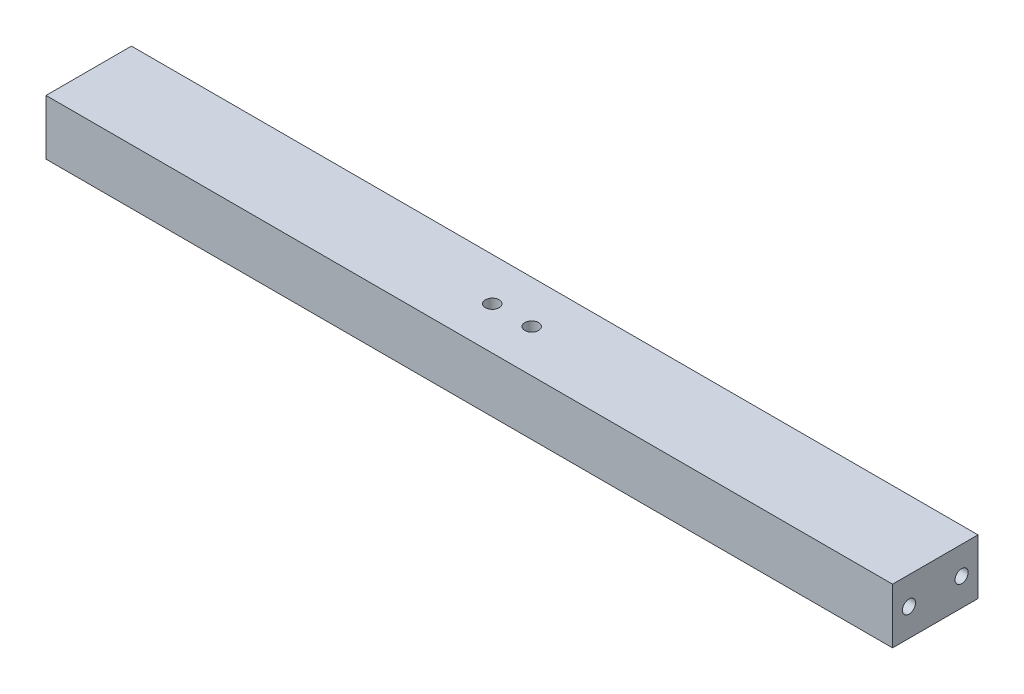
ISO-10303-21;
HEADER;
FILE_DESCRIPTION(('STEP AP214'),'2;1');
FILE_NAME('part.step','',(''),(''),'','','');
FILE_SCHEMA(('AUTOMOTIVE_DESIGN { 1 0 10303 214 1 1 1 1 }'));
ENDSEC;
DATA;
#1=APPLICATION_CONTEXT('core data for automotive mechanical design processes');
#2=APPLICATION_PROTOCOL_DEFINITION('international standard','automotive_design',2000,#1);
#3=PRODUCT_CONTEXT('',#1,'mechanical');
#4=PRODUCT('Part','Part','',(#3));
#5=PRODUCT_RELATED_PRODUCT_CATEGORY('part','',(#4));
#6=PRODUCT_DEFINITION_FORMATION('','',#4);
#7=PRODUCT_DEFINITION_CONTEXT('part definition',#1,'design');
#8=PRODUCT_DEFINITION('design','',#6,#7);
#9=PRODUCT_DEFINITION_SHAPE('','',#8);
#10=(LENGTH_UNIT() NAMED_UNIT(*) SI_UNIT(.MILLI.,.METRE.));
#11=(NAMED_UNIT(*) PLANE_ANGLE_UNIT() SI_UNIT($,.RADIAN.));
#12=(NAMED_UNIT(*) SI_UNIT($,.STERADIAN.) SOLID_ANGLE_UNIT());
#13=UNCERTAINTY_MEASURE_WITH_UNIT(LENGTH_MEASURE(1.E-05),#10,'distance_accuracy_value','');
#14=(GEOMETRIC_REPRESENTATION_CONTEXT(3) GLOBAL_UNCERTAINTY_ASSIGNED_CONTEXT((#13)) GLOBAL_UNIT_ASSIGNED_CONTEXT((#10,
#11,#12)) REPRESENTATION_CONTEXT('',''));
#15=CARTESIAN_POINT('',(0.,0.,0.));
#16=DIRECTION('',(0.,0.,1.));
#17=DIRECTION('',(1.,0.,0.));
#18=AXIS2_PLACEMENT_3D('',#15,#16,#17);
#19=CARTESIAN_POINT('',(-322.,21.,-65.));
#20=DIRECTION('',(-1.,0.,0.));
#21=DIRECTION('',(0.,0.,1.));
#22=AXIS2_PLACEMENT_3D('',#19,#20,#21);
#23=PLANE('',#22);
#24=CARTESIAN_POINT('',(-322.,0.,-12.5));
#25=DIRECTION('',(-1.,0.,0.));
#26=DIRECTION('',(0.,0.,1.));
#27=AXIS2_PLACEMENT_3D('',#24,#25,#26);
#28=CIRCLE('',#27,5.);
#29=CARTESIAN_POINT('',(-322.,0.,-7.5));
#30=VERTEX_POINT('',#29);
#31=EDGE_CURVE('E201',#30,#30,#28,.F.);
#32=ORIENTED_EDGE('',*,*,#31,.T.);
#33=EDGE_LOOP('',(#32));
#34=FACE_BOUND('',#33,.T.);
#35=CARTESIAN_POINT('',(-322.,0.,-52.5));
#36=DIRECTION('',(-1.,0.,0.));
#37=DIRECTION('',(0.,0.,1.));
#38=AXIS2_PLACEMENT_3D('',#35,#36,#37);
#39=CIRCLE('',#38,5.);
#40=CARTESIAN_POINT('',(-322.,0.,-47.5));
#41=VERTEX_POINT('',#40);
#42=EDGE_CURVE('E215',#41,#41,#39,.F.);
#43=ORIENTED_EDGE('',*,*,#42,.T.);
#44=EDGE_LOOP('',(#43));
#45=FACE_BOUND('',#44,.T.);
#46=DIRECTION('',(0.,-1.,0.));
#47=VECTOR('',#46,1.);
#48=CARTESIAN_POINT('',(-322.,21.,0.));
#49=LINE('',#48,#47);
#50=CARTESIAN_POINT('',(-322.,21.,0.));
#51=VERTEX_POINT('',#50);
#52=CARTESIAN_POINT('',(-322.,-21.,0.));
#53=VERTEX_POINT('',#52);
#54=EDGE_CURVE('E162',#51,#53,#49,.T.);
#55=ORIENTED_EDGE('',*,*,#54,.F.);
#56=DIRECTION('',(0.,0.,1.));
#57=VECTOR('',#56,1.);
#58=CARTESIAN_POINT('',(-322.,21.,-65.));
#59=LINE('',#58,#57);
#60=CARTESIAN_POINT('',(-322.,21.,-65.));
#61=VERTEX_POINT('',#60);
#62=EDGE_CURVE('E12',#61,#51,#59,.T.);
#63=ORIENTED_EDGE('',*,*,#62,.F.);
#64=DIRECTION('',(0.,-1.,0.));
#65=VECTOR('',#64,1.);
#66=CARTESIAN_POINT('',(-322.,21.,-65.));
#67=LINE('',#66,#65);
#68=CARTESIAN_POINT('',(-322.,-21.,-65.));
#69=VERTEX_POINT('',#68);
#70=EDGE_CURVE('E163',#61,#69,#67,.T.);
#71=ORIENTED_EDGE('',*,*,#70,.T.);
#72=DIRECTION('',(0.,0.,1.));
#73=VECTOR('',#72,1.);
#74=CARTESIAN_POINT('',(-322.,-21.,-65.));
#75=LINE('',#74,#73);
#76=EDGE_CURVE('E91',#69,#53,#75,.T.);
#77=ORIENTED_EDGE('',*,*,#76,.T.);
#78=EDGE_LOOP('',(#55,#63,#71,#77));
#79=FACE_BOUND('',#78,.T.);
#80=ADVANCED_FACE('F41',(#34,#45,#79),#23,.T.);
#81=CARTESIAN_POINT('',(-322.,21.,-65.));
#82=DIRECTION('',(0.,1.,0.));
#83=DIRECTION('',(-1.,0.,0.));
#84=AXIS2_PLACEMENT_3D('',#81,#82,#83);
#85=PLANE('',#84);
#86=CARTESIAN_POINT('',(-15.,21.,-32.5));
#87=DIRECTION('',(0.,-1.,0.));
#88=DIRECTION('',(1.,0.,0.));
#89=AXIS2_PLACEMENT_3D('',#86,#87,#88);
#90=CIRCLE('',#89,5.25);
#91=CARTESIAN_POINT('',(-9.74999999999999,21.,-32.5));
#92=VERTEX_POINT('',#91);
#93=EDGE_CURVE('E230',#92,#92,#90,.T.);
#94=ORIENTED_EDGE('',*,*,#93,.T.);
#95=EDGE_LOOP('',(#94));
#96=FACE_BOUND('',#95,.T.);
#97=CARTESIAN_POINT('',(15.,21.,-32.5));
#98=DIRECTION('',(0.,-1.,0.));
#99=DIRECTION('',(1.,0.,0.));
#100=AXIS2_PLACEMENT_3D('',#97,#98,#99);
#101=CIRCLE('',#100,5.25);
#102=CARTESIAN_POINT('',(20.25,21.,-32.5));
#103=VERTEX_POINT('',#102);
#104=EDGE_CURVE('E229',#103,#103,#101,.T.);
#105=ORIENTED_EDGE('',*,*,#104,.T.);
#106=EDGE_LOOP('',(#105));
#107=FACE_BOUND('',#106,.T.);
#108=DIRECTION('',(-1.,0.,0.));
#109=VECTOR('',#108,1.);
#110=CARTESIAN_POINT('',(-322.,21.,0.));
#111=LINE('',#110,#109);
#112=CARTESIAN_POINT('',(322.,21.,0.));
#113=VERTEX_POINT('',#112);
#114=EDGE_CURVE('E167',#113,#51,#111,.T.);
#115=ORIENTED_EDGE('',*,*,#114,.F.);
#116=DIRECTION('',(0.,0.,1.));
#117=VECTOR('',#116,1.);
#118=CARTESIAN_POINT('',(322.,21.,-65.));
#119=LINE('',#118,#117);
#120=CARTESIAN_POINT('',(322.,21.,-65.));
#121=VERTEX_POINT('',#120);
#122=EDGE_CURVE('E50',#121,#113,#119,.T.);
#123=ORIENTED_EDGE('',*,*,#122,.F.);
#124=DIRECTION('',(-1.,0.,0.));
#125=VECTOR('',#124,1.);
#126=CARTESIAN_POINT('',(-322.,21.,-65.));
#127=LINE('',#126,#125);
#128=EDGE_CURVE('E174',#121,#61,#127,.T.);
#129=ORIENTED_EDGE('',*,*,#128,.T.);
#130=ORIENTED_EDGE('',*,*,#62,.T.);
#131=EDGE_LOOP('',(#115,#123,#129,#130));
#132=FACE_BOUND('',#131,.T.);
#133=ADVANCED_FACE('F263',(#96,#107,#132),#85,.T.);
#134=CARTESIAN_POINT('',(322.,21.,-65.));
#135=DIRECTION('',(1.,0.,0.));
#136=DIRECTION('',(0.,0.,-1.));
#137=AXIS2_PLACEMENT_3D('',#134,#135,#136);
#138=PLANE('',#137);
#139=CARTESIAN_POINT('',(322.,0.,-12.5));
#140=DIRECTION('',(1.,0.,0.));
#141=DIRECTION('',(0.,0.,-1.));
#142=AXIS2_PLACEMENT_3D('',#139,#140,#141);
#143=CIRCLE('',#142,5.);
#144=CARTESIAN_POINT('',(322.,0.,-17.5));
#145=VERTEX_POINT('',#144);
#146=EDGE_CURVE('E209',#145,#145,#143,.T.);
#147=ORIENTED_EDGE('',*,*,#146,.F.);
#148=EDGE_LOOP('',(#147));
#149=FACE_BOUND('',#148,.T.);
#150=CARTESIAN_POINT('',(322.,0.,-52.5));
#151=DIRECTION('',(1.,0.,0.));
#152=DIRECTION('',(0.,0.,-1.));
#153=AXIS2_PLACEMENT_3D('',#150,#151,#152);
#154=CIRCLE('',#153,5.);
#155=CARTESIAN_POINT('',(322.,0.,-57.5));
#156=VERTEX_POINT('',#155);
#157=EDGE_CURVE('E218',#156,#156,#154,.T.);
#158=ORIENTED_EDGE('',*,*,#157,.F.);
#159=EDGE_LOOP('',(#158));
#160=FACE_BOUND('',#159,.T.);
#161=DIRECTION('',(0.,1.,0.));
#162=VECTOR('',#161,1.);
#163=CARTESIAN_POINT('',(322.,21.,0.));
#164=LINE('',#163,#162);
#165=CARTESIAN_POINT('',(322.,-21.,0.));
#166=VERTEX_POINT('',#165);
#167=EDGE_CURVE('E184',#166,#113,#164,.T.);
#168=ORIENTED_EDGE('',*,*,#167,.F.);
#169=DIRECTION('',(0.,0.,1.));
#170=VECTOR('',#169,1.);
#171=CARTESIAN_POINT('',(322.,-21.,-65.));
#172=LINE('',#171,#170);
#173=CARTESIAN_POINT('',(322.,-21.,-65.));
#174=VERTEX_POINT('',#173);
#175=EDGE_CURVE('E193',#174,#166,#172,.T.);
#176=ORIENTED_EDGE('',*,*,#175,.F.);
#177=DIRECTION('',(0.,1.,0.));
#178=VECTOR('',#177,1.);
#179=CARTESIAN_POINT('',(322.,21.,-65.));
#180=LINE('',#179,#178);
#181=EDGE_CURVE('E170',#174,#121,#180,.T.);
#182=ORIENTED_EDGE('',*,*,#181,.T.);
#183=ORIENTED_EDGE('',*,*,#122,.T.);
#184=EDGE_LOOP('',(#168,#176,#182,#183));
#185=FACE_BOUND('',#184,.T.);
#186=ADVANCED_FACE('F256',(#149,#160,#185),#138,.T.);
#187=CARTESIAN_POINT('',(-322.,-21.,-65.));
#188=DIRECTION('',(0.,-1.,0.));
#189=DIRECTION('',(1.,0.,0.));
#190=AXIS2_PLACEMENT_3D('',#187,#188,#189);
#191=PLANE('',#190);
#192=DIRECTION('',(0.,0.,1.));
#193=VECTOR('',#192,1.);
#194=CARTESIAN_POINT('',(312.,-21.,-5.));
#195=LINE('',#194,#193);
#196=CARTESIAN_POINT('',(312.,-21.,-60.));
#197=VERTEX_POINT('',#196);
#198=CARTESIAN_POINT('',(312.,-21.,-5.));
#199=VERTEX_POINT('',#198);
#200=EDGE_CURVE('E133',#197,#199,#195,.T.);
#201=ORIENTED_EDGE('',*,*,#200,.F.);
#202=DIRECTION('',(1.,0.,0.));
#203=VECTOR('',#202,1.);
#204=CARTESIAN_POINT('',(-312.,-21.,-60.));
#205=LINE('',#204,#203);
#206=CARTESIAN_POINT('',(-312.,-21.,-60.));
#207=VERTEX_POINT('',#206);
#208=EDGE_CURVE('E147',#207,#197,#205,.T.);
#209=ORIENTED_EDGE('',*,*,#208,.F.);
#210=DIRECTION('',(0.,0.,-1.));
#211=VECTOR('',#210,1.);
#212=CARTESIAN_POINT('',(-312.,-21.,-60.));
#213=LINE('',#212,#211);
#214=CARTESIAN_POINT('',(-312.,-21.,-5.));
#215=VERTEX_POINT('',#214);
#216=EDGE_CURVE('E58',#215,#207,#213,.T.);
#217=ORIENTED_EDGE('',*,*,#216,.F.);
#218=DIRECTION('',(-1.,0.,0.));
#219=VECTOR('',#218,1.);
#220=CARTESIAN_POINT('',(-312.,-21.,-5.));
#221=LINE('',#220,#219);
#222=EDGE_CURVE('E143',#199,#215,#221,.T.);
#223=ORIENTED_EDGE('',*,*,#222,.F.);
#224=EDGE_LOOP('',(#201,#209,#217,#223));
#225=FACE_BOUND('',#224,.T.);
#226=DIRECTION('',(1.,0.,0.));
#227=VECTOR('',#226,1.);
#228=CARTESIAN_POINT('',(-322.,-21.,0.));
#229=LINE('',#228,#227);
#230=EDGE_CURVE('E180',#53,#166,#229,.T.);
#231=ORIENTED_EDGE('',*,*,#230,.F.);
#232=ORIENTED_EDGE('',*,*,#76,.F.);
#233=DIRECTION('',(1.,0.,0.));
#234=VECTOR('',#233,1.);
#235=CARTESIAN_POINT('',(-322.,-21.,-65.));
#236=LINE('',#235,#234);
#237=EDGE_CURVE('E166',#69,#174,#236,.T.);
#238=ORIENTED_EDGE('',*,*,#237,.T.);
#239=ORIENTED_EDGE('',*,*,#175,.T.);
#240=EDGE_LOOP('',(#231,#232,#238,#239));
#241=FACE_BOUND('',#240,.T.);
#242=ADVANCED_FACE('F253',(#225,#241),#191,.T.);
#243=CARTESIAN_POINT('',(0.,0.,-65.));
#244=DIRECTION('',(0.,0.,1.));
#245=DIRECTION('',(1.,0.,0.));
#246=AXIS2_PLACEMENT_3D('',#243,#244,#245);
#247=PLANE('',#246);
#248=ORIENTED_EDGE('',*,*,#70,.F.);
#249=ORIENTED_EDGE('',*,*,#128,.F.);
#250=ORIENTED_EDGE('',*,*,#181,.F.);
#251=ORIENTED_EDGE('',*,*,#237,.F.);
#252=EDGE_LOOP('',(#248,#249,#250,#251));
#253=FACE_BOUND('',#252,.T.);
#254=ADVANCED_FACE('F255',(#253),#247,.F.);
#255=CARTESIAN_POINT('',(0.,0.,0.));
#256=DIRECTION('',(0.,0.,1.));
#257=DIRECTION('',(1.,0.,0.));
#258=AXIS2_PLACEMENT_3D('',#255,#256,#257);
#259=PLANE('',#258);
#260=ORIENTED_EDGE('',*,*,#54,.T.);
#261=ORIENTED_EDGE('',*,*,#230,.T.);
#262=ORIENTED_EDGE('',*,*,#167,.T.);
#263=ORIENTED_EDGE('',*,*,#114,.T.);
#264=EDGE_LOOP('',(#260,#261,#262,#263));
#265=FACE_BOUND('',#264,.T.);
#266=ADVANCED_FACE('F259',(#265),#259,.T.);
#267=CARTESIAN_POINT('',(-322.,11.,-65.));
#268=DIRECTION('',(0.,1.,0.));
#269=DIRECTION('',(-1.,0.,0.));
#270=AXIS2_PLACEMENT_3D('',#267,#268,#269);
#271=PLANE('',#270);
#272=CARTESIAN_POINT('',(-15.,11.,-32.5));
#273=DIRECTION('',(0.,1.,0.));
#274=DIRECTION('',(-1.,0.,0.));
#275=AXIS2_PLACEMENT_3D('',#272,#273,#274);
#276=CIRCLE('',#275,5.25);
#277=CARTESIAN_POINT('',(-20.25,11.,-32.5));
#278=VERTEX_POINT('',#277);
#279=EDGE_CURVE('E234',#278,#278,#276,.T.);
#280=ORIENTED_EDGE('',*,*,#279,.T.);
#281=EDGE_LOOP('',(#280));
#282=FACE_BOUND('',#281,.T.);
#283=CARTESIAN_POINT('',(15.,11.,-32.5));
#284=DIRECTION('',(0.,1.,0.));
#285=DIRECTION('',(-1.,0.,0.));
#286=AXIS2_PLACEMENT_3D('',#283,#284,#285);
#287=CIRCLE('',#286,5.25);
#288=CARTESIAN_POINT('',(9.75000000000001,11.,-32.5));
#289=VERTEX_POINT('',#288);
#290=EDGE_CURVE('E235',#289,#289,#287,.T.);
#291=ORIENTED_EDGE('',*,*,#290,.T.);
#292=EDGE_LOOP('',(#291));
#293=FACE_BOUND('',#292,.T.);
#294=DIRECTION('',(1.,0.,0.));
#295=VECTOR('',#294,1.);
#296=CARTESIAN_POINT('',(-312.,11.,-60.));
#297=LINE('',#296,#295);
#298=CARTESIAN_POINT('',(-312.,11.,-60.));
#299=VERTEX_POINT('',#298);
#300=CARTESIAN_POINT('',(312.,11.,-60.));
#301=VERTEX_POINT('',#300);
#302=EDGE_CURVE('E138',#299,#301,#297,.T.);
#303=ORIENTED_EDGE('',*,*,#302,.T.);
#304=DIRECTION('',(0.,0.,1.));
#305=VECTOR('',#304,1.);
#306=CARTESIAN_POINT('',(312.,11.,-5.));
#307=LINE('',#306,#305);
#308=CARTESIAN_POINT('',(312.,11.,-5.));
#309=VERTEX_POINT('',#308);
#310=EDGE_CURVE('E130',#301,#309,#307,.T.);
#311=ORIENTED_EDGE('',*,*,#310,.T.);
#312=DIRECTION('',(-1.,0.,0.));
#313=VECTOR('',#312,1.);
#314=CARTESIAN_POINT('',(-312.,11.,-5.));
#315=LINE('',#314,#313);
#316=CARTESIAN_POINT('',(-312.,11.,-5.));
#317=VERTEX_POINT('',#316);
#318=EDGE_CURVE('E116',#309,#317,#315,.T.);
#319=ORIENTED_EDGE('',*,*,#318,.T.);
#320=DIRECTION('',(0.,0.,-1.));
#321=VECTOR('',#320,1.);
#322=CARTESIAN_POINT('',(-312.,11.,-60.));
#323=LINE('',#322,#321);
#324=EDGE_CURVE('E153',#317,#299,#323,.T.);
#325=ORIENTED_EDGE('',*,*,#324,.T.);
#326=EDGE_LOOP('',(#303,#311,#319,#325));
#327=FACE_BOUND('',#326,.T.);
#328=ADVANCED_FACE('F137',(#282,#293,#327),#271,.F.);
#329=CARTESIAN_POINT('',(312.,647.419188722696,-5.));
#330=DIRECTION('',(1.,0.,0.));
#331=DIRECTION('',(0.,1.,0.));
#332=AXIS2_PLACEMENT_3D('',#329,#330,#331);
#333=PLANE('',#332);
#334=CARTESIAN_POINT('',(312.,0.,-12.5));
#335=DIRECTION('',(1.,0.,0.));
#336=DIRECTION('',(0.,1.,0.));
#337=AXIS2_PLACEMENT_3D('',#334,#335,#336);
#338=CIRCLE('',#337,5.);
#339=CARTESIAN_POINT('',(312.,5.,-12.5));
#340=VERTEX_POINT('',#339);
#341=EDGE_CURVE('E225',#340,#340,#338,.T.);
#342=ORIENTED_EDGE('',*,*,#341,.T.);
#343=EDGE_LOOP('',(#342));
#344=FACE_BOUND('',#343,.T.);
#345=CARTESIAN_POINT('',(312.,0.,-52.5));
#346=DIRECTION('',(1.,0.,0.));
#347=DIRECTION('',(0.,1.,0.));
#348=AXIS2_PLACEMENT_3D('',#345,#346,#347);
#349=CIRCLE('',#348,5.);
#350=CARTESIAN_POINT('',(312.,5.,-52.5));
#351=VERTEX_POINT('',#350);
#352=EDGE_CURVE('E200',#351,#351,#349,.T.);
#353=ORIENTED_EDGE('',*,*,#352,.T.);
#354=EDGE_LOOP('',(#353));
#355=FACE_BOUND('',#354,.T.);
#356=DIRECTION('',(0.,-1.,0.));
#357=VECTOR('',#356,1.);
#358=CARTESIAN_POINT('',(312.,647.419188722696,-60.));
#359=LINE('',#358,#357);
#360=EDGE_CURVE('E151',#301,#197,#359,.T.);
#361=ORIENTED_EDGE('',*,*,#360,.T.);
#362=ORIENTED_EDGE('',*,*,#200,.T.);
#363=DIRECTION('',(0.,-1.,0.));
#364=VECTOR('',#363,1.);
#365=CARTESIAN_POINT('',(312.,647.419188722696,-5.));
#366=LINE('',#365,#364);
#367=EDGE_CURVE('E120',#309,#199,#366,.T.);
#368=ORIENTED_EDGE('',*,*,#367,.F.);
#369=ORIENTED_EDGE('',*,*,#310,.F.);
#370=EDGE_LOOP('',(#361,#362,#368,#369));
#371=FACE_BOUND('',#370,.T.);
#372=ADVANCED_FACE('F129',(#344,#355,#371),#333,.F.);
#373=CARTESIAN_POINT('',(-312.,647.419188722696,-5.));
#374=DIRECTION('',(0.,0.,1.));
#375=DIRECTION('',(1.,0.,0.));
#376=AXIS2_PLACEMENT_3D('',#373,#374,#375);
#377=PLANE('',#376);
#378=ORIENTED_EDGE('',*,*,#367,.T.);
#379=ORIENTED_EDGE('',*,*,#222,.T.);
#380=DIRECTION('',(0.,-1.,0.));
#381=VECTOR('',#380,1.);
#382=CARTESIAN_POINT('',(-312.,647.419188722696,-5.));
#383=LINE('',#382,#381);
#384=EDGE_CURVE('E122',#317,#215,#383,.T.);
#385=ORIENTED_EDGE('',*,*,#384,.F.);
#386=ORIENTED_EDGE('',*,*,#318,.F.);
#387=EDGE_LOOP('',(#378,#379,#385,#386));
#388=FACE_BOUND('',#387,.T.);
#389=ADVANCED_FACE('F118',(#388),#377,.F.);
#390=CARTESIAN_POINT('',(-312.,647.419188722696,-60.));
#391=DIRECTION('',(-1.,0.,0.));
#392=DIRECTION('',(0.,-1.,0.));
#393=AXIS2_PLACEMENT_3D('',#390,#391,#392);
#394=PLANE('',#393);
#395=CARTESIAN_POINT('',(-312.,0.,-12.5));
#396=DIRECTION('',(-1.,0.,0.));
#397=DIRECTION('',(0.,-1.,0.));
#398=AXIS2_PLACEMENT_3D('',#395,#396,#397);
#399=CIRCLE('',#398,5.);
#400=CARTESIAN_POINT('',(-312.,-5.,-12.5));
#401=VERTEX_POINT('',#400);
#402=EDGE_CURVE('E44',#401,#401,#399,.T.);
#403=ORIENTED_EDGE('',*,*,#402,.T.);
#404=EDGE_LOOP('',(#403));
#405=FACE_BOUND('',#404,.T.);
#406=CARTESIAN_POINT('',(-312.,0.,-52.5));
#407=DIRECTION('',(-1.,0.,0.));
#408=DIRECTION('',(0.,-1.,0.));
#409=AXIS2_PLACEMENT_3D('',#406,#407,#408);
#410=CIRCLE('',#409,5.);
#411=CARTESIAN_POINT('',(-312.,-5.,-52.5));
#412=VERTEX_POINT('',#411);
#413=EDGE_CURVE('E197',#412,#412,#410,.T.);
#414=ORIENTED_EDGE('',*,*,#413,.T.);
#415=EDGE_LOOP('',(#414));
#416=FACE_BOUND('',#415,.T.);
#417=ORIENTED_EDGE('',*,*,#384,.T.);
#418=ORIENTED_EDGE('',*,*,#216,.T.);
#419=DIRECTION('',(0.,-1.,0.));
#420=VECTOR('',#419,1.);
#421=CARTESIAN_POINT('',(-312.,647.419188722696,-60.));
#422=LINE('',#421,#420);
#423=EDGE_CURVE('E152',#299,#207,#422,.T.);
#424=ORIENTED_EDGE('',*,*,#423,.F.);
#425=ORIENTED_EDGE('',*,*,#324,.F.);
#426=EDGE_LOOP('',(#417,#418,#424,#425));
#427=FACE_BOUND('',#426,.T.);
#428=ADVANCED_FACE('F315',(#405,#416,#427),#394,.F.);
#429=CARTESIAN_POINT('',(-312.,647.419188722696,-60.));
#430=DIRECTION('',(0.,0.,-1.));
#431=DIRECTION('',(-1.,0.,0.));
#432=AXIS2_PLACEMENT_3D('',#429,#430,#431);
#433=PLANE('',#432);
#434=ORIENTED_EDGE('',*,*,#423,.T.);
#435=ORIENTED_EDGE('',*,*,#208,.T.);
#436=ORIENTED_EDGE('',*,*,#360,.F.);
#437=ORIENTED_EDGE('',*,*,#302,.F.);
#438=EDGE_LOOP('',(#434,#435,#436,#437));
#439=FACE_BOUND('',#438,.T.);
#440=ADVANCED_FACE('F251',(#439),#433,.F.);
#441=CARTESIAN_POINT('',(15.,-3.84924240491751,-32.5));
#442=DIRECTION('',(0.,1.,0.));
#443=DIRECTION('',(-1.,0.,0.));
#444=AXIS2_PLACEMENT_3D('',#441,#442,#443);
#445=CYLINDRICAL_SURFACE('',#444,5.25);
#446=ORIENTED_EDGE('',*,*,#290,.F.);
#447=EDGE_LOOP('',(#446));
#448=FACE_BOUND('',#447,.T.);
#449=ORIENTED_EDGE('',*,*,#104,.F.);
#450=EDGE_LOOP('',(#449));
#451=FACE_BOUND('',#450,.T.);
#452=ADVANCED_FACE('F295',(#448,#451),#445,.F.);
#453=CARTESIAN_POINT('',(-15.,-3.84924240491751,-32.5));
#454=DIRECTION('',(0.,1.,0.));
#455=DIRECTION('',(-1.,0.,0.));
#456=AXIS2_PLACEMENT_3D('',#453,#454,#455);
#457=CYLINDRICAL_SURFACE('',#456,5.25);
#458=ORIENTED_EDGE('',*,*,#279,.F.);
#459=EDGE_LOOP('',(#458));
#460=FACE_BOUND('',#459,.T.);
#461=ORIENTED_EDGE('',*,*,#93,.F.);
#462=EDGE_LOOP('',(#461));
#463=FACE_BOUND('',#462,.T.);
#464=ADVANCED_FACE('F285',(#460,#463),#457,.F.);
#465=CARTESIAN_POINT('',(-336.142135623731,0.,-52.5));
#466=DIRECTION('',(1.,0.,0.));
#467=DIRECTION('',(0.,0.,-1.));
#468=AXIS2_PLACEMENT_3D('',#465,#466,#467);
#469=CYLINDRICAL_SURFACE('',#468,5.);
#470=ORIENTED_EDGE('',*,*,#42,.F.);
#471=EDGE_LOOP('',(#470));
#472=FACE_BOUND('',#471,.T.);
#473=ORIENTED_EDGE('',*,*,#413,.F.);
#474=EDGE_LOOP('',(#473));
#475=FACE_BOUND('',#474,.T.);
#476=ADVANCED_FACE('F281',(#472,#475),#469,.F.);
#477=CARTESIAN_POINT('',(-336.142135623731,0.,-12.5));
#478=DIRECTION('',(1.,0.,0.));
#479=DIRECTION('',(0.,0.,-1.));
#480=AXIS2_PLACEMENT_3D('',#477,#478,#479);
#481=CYLINDRICAL_SURFACE('',#480,5.);
#482=ORIENTED_EDGE('',*,*,#31,.F.);
#483=EDGE_LOOP('',(#482));
#484=FACE_BOUND('',#483,.T.);
#485=ORIENTED_EDGE('',*,*,#402,.F.);
#486=EDGE_LOOP('',(#485));
#487=FACE_BOUND('',#486,.T.);
#488=ADVANCED_FACE('F284',(#484,#487),#481,.F.);
#489=ORIENTED_EDGE('',*,*,#157,.T.);
#490=EDGE_LOOP('',(#489));
#491=FACE_BOUND('',#490,.T.);
#492=ORIENTED_EDGE('',*,*,#352,.F.);
#493=EDGE_LOOP('',(#492));
#494=FACE_BOUND('',#493,.T.);
#495=ADVANCED_FACE('F287',(#491,#494),#469,.F.);
#496=ORIENTED_EDGE('',*,*,#146,.T.);
#497=EDGE_LOOP('',(#496));
#498=FACE_BOUND('',#497,.T.);
#499=ORIENTED_EDGE('',*,*,#341,.F.);
#500=EDGE_LOOP('',(#499));
#501=FACE_BOUND('',#500,.T.);
#502=ADVANCED_FACE('F294',(#498,#501),#481,.F.);
#503=CLOSED_SHELL('',(#80,#133,#186,#242,#254,#266,#328,#372,#389,#428,#440,#452,#464,#476,#488,
#495,#502));
#504=MANIFOLD_SOLID_BREP('B2',#503);
#505=ADVANCED_BREP_SHAPE_REPRESENTATION('',(#18,#504),#14);
#506=SHAPE_DEFINITION_REPRESENTATION(#9,#505);
ENDSEC;
END-ISO-10303-21;
